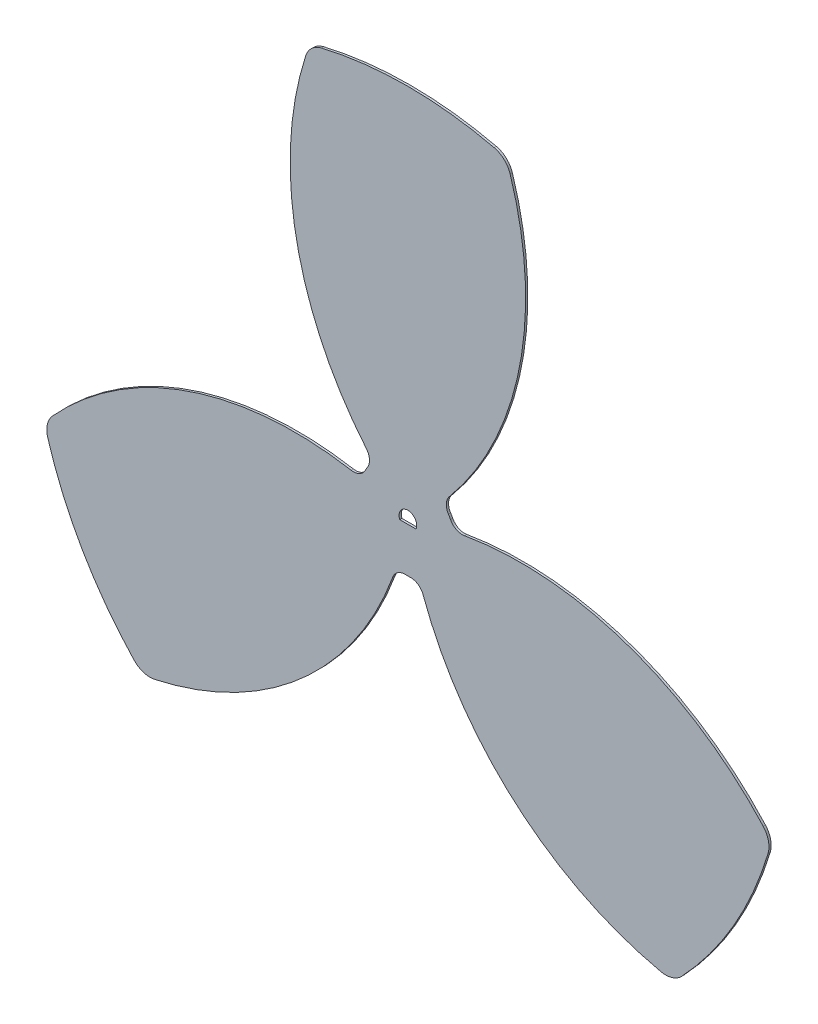
ISO-10303-21;
HEADER;
FILE_DESCRIPTION(('STEP AP214'),'2;1');
FILE_NAME('part.step','',(''),(''),'','','');
FILE_SCHEMA(('AUTOMOTIVE_DESIGN { 1 0 10303 214 1 1 1 1 }'));
ENDSEC;
DATA;
#1=APPLICATION_CONTEXT('core data for automotive mechanical design processes');
#2=APPLICATION_PROTOCOL_DEFINITION('international standard','automotive_design',2000,#1);
#3=PRODUCT_CONTEXT('',#1,'mechanical');
#4=PRODUCT('Part','Part','',(#3));
#5=PRODUCT_RELATED_PRODUCT_CATEGORY('part','',(#4));
#6=PRODUCT_DEFINITION_FORMATION('','',#4);
#7=PRODUCT_DEFINITION_CONTEXT('part definition',#1,'design');
#8=PRODUCT_DEFINITION('design','',#6,#7);
#9=PRODUCT_DEFINITION_SHAPE('','',#8);
#10=(LENGTH_UNIT() NAMED_UNIT(*) SI_UNIT(.MILLI.,.METRE.));
#11=(NAMED_UNIT(*) PLANE_ANGLE_UNIT() SI_UNIT($,.RADIAN.));
#12=(NAMED_UNIT(*) SI_UNIT($,.STERADIAN.) SOLID_ANGLE_UNIT());
#13=UNCERTAINTY_MEASURE_WITH_UNIT(LENGTH_MEASURE(1.E-05),#10,'distance_accuracy_value','');
#14=(GEOMETRIC_REPRESENTATION_CONTEXT(3) GLOBAL_UNCERTAINTY_ASSIGNED_CONTEXT((#13)) GLOBAL_UNIT_ASSIGNED_CONTEXT((#10,
#11,#12)) REPRESENTATION_CONTEXT('',''));
#15=CARTESIAN_POINT('',(0.,0.,0.));
#16=DIRECTION('',(0.,0.,1.));
#17=DIRECTION('',(1.,0.,0.));
#18=AXIS2_PLACEMENT_3D('',#15,#16,#17);
#19=CARTESIAN_POINT('',(51.7426711315438,150.346382184181,1.));
#20=DIRECTION('',(0.,0.,-1.));
#21=DIRECTION('',(-1.,0.,0.));
#22=AXIS2_PLACEMENT_3D('',#19,#20,#21);
#23=CYLINDRICAL_SURFACE('',#22,148.192977627793);
#24=CARTESIAN_POINT('',(51.7426711315438,150.346382184181,0.));
#25=DIRECTION('',(0.,0.,1.));
#26=DIRECTION('',(1.,0.,0.));
#27=AXIS2_PLACEMENT_3D('',#24,#25,#26);
#28=CIRCLE('',#27,148.192977627793);
#29=CARTESIAN_POINT('',(-89.4488248885642,195.358825683678,0.));
#30=VERTEX_POINT('',#29);
#31=CARTESIAN_POINT('',(-61.9898161621901,55.3406983954088,0.));
#32=VERTEX_POINT('',#31);
#33=EDGE_CURVE('E234',#30,#32,#28,.T.);
#34=ORIENTED_EDGE('',*,*,#33,.T.);
#35=DIRECTION('',(0.,0.,-1.));
#36=VECTOR('',#35,1.);
#37=CARTESIAN_POINT('',(-61.9898161621901,55.3406983954088,1.));
#38=LINE('',#37,#36);
#39=CARTESIAN_POINT('',(-61.9898161621901,55.3406983954088,1.));
#40=VERTEX_POINT('',#39);
#41=EDGE_CURVE('E364',#32,#40,#38,.F.);
#42=ORIENTED_EDGE('',*,*,#41,.T.);
#43=CARTESIAN_POINT('',(51.7426711315438,150.346382184181,1.));
#44=DIRECTION('',(0.,0.,1.));
#45=DIRECTION('',(1.,0.,0.));
#46=AXIS2_PLACEMENT_3D('',#43,#44,#45);
#47=CIRCLE('',#46,148.192977627793);
#48=CARTESIAN_POINT('',(-89.4488248885642,195.358825683678,1.));
#49=VERTEX_POINT('',#48);
#50=EDGE_CURVE('E236',#49,#40,#47,.T.);
#51=ORIENTED_EDGE('',*,*,#50,.F.);
#52=DIRECTION('',(0.,0.,-1.));
#53=VECTOR('',#52,1.);
#54=CARTESIAN_POINT('',(-89.4488248885642,195.358825683678,1.));
#55=LINE('',#54,#53);
#56=EDGE_CURVE('E349',#49,#30,#55,.T.);
#57=ORIENTED_EDGE('',*,*,#56,.T.);
#58=EDGE_LOOP('',(#34,#42,#51,#57));
#59=FACE_BOUND('',#58,.T.);
#60=ADVANCED_FACE('F38',(#59),#23,.T.);
#61=CARTESIAN_POINT('',(-43.2289950101138,36.5854871082849,1.));
#62=DIRECTION('',(0.,0.,-1.));
#63=DIRECTION('',(-1.,0.,0.));
#64=AXIS2_PLACEMENT_3D('',#61,#62,#63);
#65=CYLINDRICAL_SURFACE('',#64,21.7167576854567);
#66=CARTESIAN_POINT('',(-43.2289950101138,36.5854871082849,1.));
#67=DIRECTION('',(0.,0.,1.));
#68=DIRECTION('',(1.,0.,0.));
#69=AXIS2_PLACEMENT_3D('',#66,#67,#68);
#70=CIRCLE('',#69,21.7167576854567);
#71=CARTESIAN_POINT('',(-61.5365091037477,48.2667752256219,1.));
#72=VERTEX_POINT('',#71);
#73=CARTESIAN_POINT('',(-62.4990443154705,46.599615334844,1.));
#74=VERTEX_POINT('',#73);
#75=EDGE_CURVE('E239',#72,#74,#70,.T.);
#76=ORIENTED_EDGE('',*,*,#75,.F.);
#77=DIRECTION('',(0.,0.,-1.));
#78=VECTOR('',#77,1.);
#79=CARTESIAN_POINT('',(-61.5365091037477,48.2667752256219,1.));
#80=LINE('',#79,#78);
#81=CARTESIAN_POINT('',(-61.5365091037477,48.2667752256219,0.));
#82=VERTEX_POINT('',#81);
#83=EDGE_CURVE('E361',#72,#82,#80,.T.);
#84=ORIENTED_EDGE('',*,*,#83,.T.);
#85=CARTESIAN_POINT('',(-43.2289950101138,36.5854871082849,0.));
#86=DIRECTION('',(0.,0.,1.));
#87=DIRECTION('',(1.,0.,0.));
#88=AXIS2_PLACEMENT_3D('',#85,#86,#87);
#89=CIRCLE('',#88,21.7167576854567);
#90=CARTESIAN_POINT('',(-62.4990443154705,46.599615334844,0.));
#91=VERTEX_POINT('',#90);
#92=EDGE_CURVE('E274',#82,#91,#89,.T.);
#93=ORIENTED_EDGE('',*,*,#92,.T.);
#94=DIRECTION('',(0.,0.,-1.));
#95=VECTOR('',#94,1.);
#96=CARTESIAN_POINT('',(-62.4990443154705,46.599615334844,1.));
#97=LINE('',#96,#95);
#98=EDGE_CURVE('E359',#91,#74,#97,.F.);
#99=ORIENTED_EDGE('',*,*,#98,.T.);
#100=EDGE_LOOP('',(#76,#84,#93,#99));
#101=FACE_BOUND('',#100,.T.);
#102=ADVANCED_FACE('F478',(#101),#65,.T.);
#103=CARTESIAN_POINT('',(-94.2629870322673,-102.542835948076,1.));
#104=DIRECTION('',(0.,0.,-1.));
#105=DIRECTION('',(-1.,0.,0.));
#106=AXIS2_PLACEMENT_3D('',#103,#104,#105);
#107=CYLINDRICAL_SURFACE('',#106,148.192977627794);
#108=CARTESIAN_POINT('',(-94.2629870322673,-102.542835948076,1.));
#109=DIRECTION('',(0.,0.,1.));
#110=DIRECTION('',(1.,0.,0.));
#111=AXIS2_PLACEMENT_3D('',#108,#109,#110);
#112=CIRCLE('',#111,148.192977627794);
#113=CARTESIAN_POINT('',(-203.840654599297,-2.77363534607959,1.));
#114=VERTEX_POINT('',#113);
#115=CARTESIAN_POINT('',(-68.8518950141466,43.4552291782761,1.));
#116=VERTEX_POINT('',#115);
#117=EDGE_CURVE('E243',#114,#116,#112,.F.);
#118=ORIENTED_EDGE('',*,*,#117,.T.);
#119=DIRECTION('',(0.,0.,-1.));
#120=VECTOR('',#119,1.);
#121=CARTESIAN_POINT('',(-68.8518950141466,43.4552291782761,1.));
#122=LINE('',#121,#120);
#123=CARTESIAN_POINT('',(-68.8518950141466,43.4552291782761,0.));
#124=VERTEX_POINT('',#123);
#125=EDGE_CURVE('E366',#116,#124,#122,.T.);
#126=ORIENTED_EDGE('',*,*,#125,.T.);
#127=CARTESIAN_POINT('',(-94.2629870322673,-102.542835948076,0.));
#128=DIRECTION('',(0.,0.,1.));
#129=DIRECTION('',(1.,0.,0.));
#130=AXIS2_PLACEMENT_3D('',#127,#128,#129);
#131=CIRCLE('',#130,148.192977627794);
#132=CARTESIAN_POINT('',(-203.840654599297,-2.77363534607959,0.));
#133=VERTEX_POINT('',#132);
#134=EDGE_CURVE('E277',#133,#124,#131,.F.);
#135=ORIENTED_EDGE('',*,*,#134,.F.);
#136=DIRECTION('',(0.,0.,-1.));
#137=VECTOR('',#136,1.);
#138=CARTESIAN_POINT('',(-203.840654599297,-2.77363534607959,1.));
#139=LINE('',#138,#137);
#140=EDGE_CURVE('E347',#133,#114,#139,.F.);
#141=ORIENTED_EDGE('',*,*,#140,.T.);
#142=EDGE_LOOP('',(#118,#126,#135,#141));
#143=FACE_BOUND('',#142,.T.);
#144=ADVANCED_FACE('F486',(#143),#107,.T.);
#145=CARTESIAN_POINT('',(-43.2289950101138,36.5854871082849,1.));
#146=DIRECTION('',(0.,0.,-1.));
#147=DIRECTION('',(-1.,0.,0.));
#148=AXIS2_PLACEMENT_3D('',#145,#146,#147);
#149=CYLINDRICAL_SURFACE('',#148,170.000000000001);
#150=CARTESIAN_POINT('',(-43.2289950101138,36.5854871082849,0.));
#151=DIRECTION('',(0.,0.,1.));
#152=DIRECTION('',(1.,0.,0.));
#153=AXIS2_PLACEMENT_3D('',#150,#151,#152);
#154=CIRCLE('',#153,170.000000000001);
#155=CARTESIAN_POINT('',(-206.022487315277,-12.386738316838,0.));
#156=VERTEX_POINT('',#155);
#157=CARTESIAN_POINT('',(-167.036932460708,-79.911700086213,0.));
#158=VERTEX_POINT('',#157);
#159=EDGE_CURVE('E280',#156,#158,#154,.T.);
#160=ORIENTED_EDGE('',*,*,#159,.T.);
#161=DIRECTION('',(0.,0.,-1.));
#162=VECTOR('',#161,1.);
#163=CARTESIAN_POINT('',(-167.036932460708,-79.911700086213,1.));
#164=LINE('',#163,#162);
#165=CARTESIAN_POINT('',(-167.036932460708,-79.911700086213,1.));
#166=VERTEX_POINT('',#165);
#167=EDGE_CURVE('E345',#158,#166,#164,.F.);
#168=ORIENTED_EDGE('',*,*,#167,.T.);
#169=CARTESIAN_POINT('',(-43.2289950101138,36.5854871082849,1.));
#170=DIRECTION('',(0.,0.,1.));
#171=DIRECTION('',(1.,0.,0.));
#172=AXIS2_PLACEMENT_3D('',#169,#170,#171);
#173=CIRCLE('',#172,170.000000000001);
#174=CARTESIAN_POINT('',(-206.022487315277,-12.386738316838,1.));
#175=VERTEX_POINT('',#174);
#176=EDGE_CURVE('E246',#175,#166,#173,.T.);
#177=ORIENTED_EDGE('',*,*,#176,.F.);
#178=DIRECTION('',(0.,0.,-1.));
#179=VECTOR('',#178,1.);
#180=CARTESIAN_POINT('',(-206.022487315277,-12.386738316838,1.));
#181=LINE('',#180,#179);
#182=EDGE_CURVE('E342',#175,#156,#181,.T.);
#183=ORIENTED_EDGE('',*,*,#182,.T.);
#184=EDGE_LOOP('',(#160,#168,#177,#183));
#185=FACE_BOUND('',#184,.T.);
#186=ADVANCED_FACE('F496',(#185),#149,.T.);
#187=CARTESIAN_POINT('',(-189.234653173923,61.9529150887447,1.));
#188=DIRECTION('',(0.,0.,-1.));
#189=DIRECTION('',(-1.,0.,0.));
#190=AXIS2_PLACEMENT_3D('',#187,#188,#189);
#191=CYLINDRICAL_SURFACE('',#190,148.192977627792);
#192=CARTESIAN_POINT('',(-189.234653173923,61.9529150887447,0.));
#193=DIRECTION('',(0.,0.,1.));
#194=DIRECTION('',(1.,0.,0.));
#195=AXIS2_PLACEMENT_3D('',#192,#193,#194);
#196=CIRCLE('',#195,148.192977627792);
#197=CARTESIAN_POINT('',(-157.620824720846,-82.828729012746,0.));
#198=VERTEX_POINT('',#197);
#199=CARTESIAN_POINT('',(-50.0910738620683,10.9605337511684,0.));
#200=VERTEX_POINT('',#199);
#201=EDGE_CURVE('E283',#198,#200,#196,.T.);
#202=ORIENTED_EDGE('',*,*,#201,.T.);
#203=DIRECTION('',(0.,0.,-1.));
#204=VECTOR('',#203,1.);
#205=CARTESIAN_POINT('',(-50.0910738620683,10.9605337511684,1.));
#206=LINE('',#205,#204);
#207=CARTESIAN_POINT('',(-50.0910738620683,10.9605337511684,1.));
#208=VERTEX_POINT('',#207);
#209=EDGE_CURVE('E400',#200,#208,#206,.F.);
#210=ORIENTED_EDGE('',*,*,#209,.T.);
#211=CARTESIAN_POINT('',(-189.234653173923,61.9529150887447,1.));
#212=DIRECTION('',(0.,0.,1.));
#213=DIRECTION('',(1.,0.,0.));
#214=AXIS2_PLACEMENT_3D('',#211,#212,#213);
#215=CIRCLE('',#214,148.192977627792);
#216=CARTESIAN_POINT('',(-157.620824720846,-82.828729012746,1.));
#217=VERTEX_POINT('',#216);
#218=EDGE_CURVE('E249',#217,#208,#215,.T.);
#219=ORIENTED_EDGE('',*,*,#218,.F.);
#220=DIRECTION('',(0.,0.,-1.));
#221=VECTOR('',#220,1.);
#222=CARTESIAN_POINT('',(-157.620824720846,-82.828729012746,1.));
#223=LINE('',#222,#221);
#224=EDGE_CURVE('E339',#217,#198,#223,.T.);
#225=ORIENTED_EDGE('',*,*,#224,.T.);
#226=EDGE_LOOP('',(#202,#210,#219,#225));
#227=FACE_BOUND('',#226,.T.);
#228=ADVANCED_FACE('F505',(#227),#191,.T.);
#229=CARTESIAN_POINT('',(-43.2289950101138,36.5854871082849,1.));
#230=DIRECTION('',(0.,0.,-1.));
#231=DIRECTION('',(-1.,0.,0.));
#232=AXIS2_PLACEMENT_3D('',#229,#230,#231);
#233=CYLINDRICAL_SURFACE('',#232,21.7167576854567);
#234=CARTESIAN_POINT('',(-43.2289950101138,36.5854871082849,1.));
#235=DIRECTION('',(0.,0.,1.));
#236=DIRECTION('',(1.,0.,0.));
#237=AXIS2_PLACEMENT_3D('',#234,#235,#236);
#238=CIRCLE('',#237,21.7167576854567);
#239=CARTESIAN_POINT('',(-44.191530221835,14.8900707643878,1.));
#240=VERTEX_POINT('',#239);
#241=CARTESIAN_POINT('',(-42.2664597983906,14.8900707643879,1.));
#242=VERTEX_POINT('',#241);
#243=EDGE_CURVE('E252',#240,#242,#238,.T.);
#244=ORIENTED_EDGE('',*,*,#243,.F.);
#245=DIRECTION('',(0.,0.,-1.));
#246=VECTOR('',#245,1.);
#247=CARTESIAN_POINT('',(-44.191530221835,14.8900707643878,1.));
#248=LINE('',#247,#246);
#249=CARTESIAN_POINT('',(-44.191530221835,14.8900707643878,0.));
#250=VERTEX_POINT('',#249);
#251=EDGE_CURVE('E397',#240,#250,#248,.T.);
#252=ORIENTED_EDGE('',*,*,#251,.T.);
#253=CARTESIAN_POINT('',(-43.2289950101138,36.5854871082849,0.));
#254=DIRECTION('',(0.,0.,1.));
#255=DIRECTION('',(1.,0.,0.));
#256=AXIS2_PLACEMENT_3D('',#253,#254,#255);
#257=CIRCLE('',#256,21.7167576854567);
#258=CARTESIAN_POINT('',(-42.2664597983906,14.8900707643879,0.));
#259=VERTEX_POINT('',#258);
#260=EDGE_CURVE('E286',#250,#259,#257,.T.);
#261=ORIENTED_EDGE('',*,*,#260,.T.);
#262=DIRECTION('',(0.,0.,-1.));
#263=VECTOR('',#262,1.);
#264=CARTESIAN_POINT('',(-42.2664597983906,14.8900707643879,1.));
#265=LINE('',#264,#263);
#266=EDGE_CURVE('E395',#259,#242,#265,.F.);
#267=ORIENTED_EDGE('',*,*,#266,.T.);
#268=EDGE_LOOP('',(#244,#252,#261,#267));
#269=FACE_BOUND('',#268,.T.);
#270=ADVANCED_FACE('F414',(#269),#233,.T.);
#271=CARTESIAN_POINT('',(102.776663153701,61.9529150887455,1.));
#272=DIRECTION('',(0.,0.,-1.));
#273=DIRECTION('',(-1.,0.,0.));
#274=AXIS2_PLACEMENT_3D('',#271,#272,#273);
#275=CYLINDRICAL_SURFACE('',#274,148.192977627795);
#276=CARTESIAN_POINT('',(102.776663153701,61.9529150887455,1.));
#277=DIRECTION('',(0.,0.,1.));
#278=DIRECTION('',(1.,0.,0.));
#279=AXIS2_PLACEMENT_3D('',#276,#277,#278);
#280=CIRCLE('',#279,148.192977627795);
#281=CARTESIAN_POINT('',(71.1628347006211,-82.8287290127473,1.));
#282=VERTEX_POINT('',#281);
#283=CARTESIAN_POINT('',(-36.3669161581567,10.9605337511686,1.));
#284=VERTEX_POINT('',#283);
#285=EDGE_CURVE('E254',#282,#284,#280,.F.);
#286=ORIENTED_EDGE('',*,*,#285,.T.);
#287=DIRECTION('',(0.,0.,-1.));
#288=VECTOR('',#287,1.);
#289=CARTESIAN_POINT('',(-36.3669161581567,10.9605337511686,1.));
#290=LINE('',#289,#288);
#291=CARTESIAN_POINT('',(-36.3669161581567,10.9605337511686,0.));
#292=VERTEX_POINT('',#291);
#293=EDGE_CURVE('E402',#284,#292,#290,.T.);
#294=ORIENTED_EDGE('',*,*,#293,.T.);
#295=CARTESIAN_POINT('',(102.776663153701,61.9529150887455,0.));
#296=DIRECTION('',(0.,0.,1.));
#297=DIRECTION('',(1.,0.,0.));
#298=AXIS2_PLACEMENT_3D('',#295,#296,#297);
#299=CIRCLE('',#298,148.192977627795);
#300=CARTESIAN_POINT('',(71.1628347006211,-82.8287290127473,0.));
#301=VERTEX_POINT('',#300);
#302=EDGE_CURVE('E289',#301,#292,#299,.F.);
#303=ORIENTED_EDGE('',*,*,#302,.F.);
#304=DIRECTION('',(0.,0.,-1.));
#305=VECTOR('',#304,1.);
#306=CARTESIAN_POINT('',(71.1628347006211,-82.8287290127473,1.));
#307=LINE('',#306,#305);
#308=EDGE_CURVE('E337',#301,#282,#307,.F.);
#309=ORIENTED_EDGE('',*,*,#308,.T.);
#310=EDGE_LOOP('',(#286,#294,#303,#309));
#311=FACE_BOUND('',#310,.T.);
#312=ADVANCED_FACE('F417',(#311),#275,.T.);
#313=CARTESIAN_POINT('',(-43.2289950101138,36.5854871082849,1.));
#314=DIRECTION('',(0.,0.,-1.));
#315=DIRECTION('',(-1.,0.,0.));
#316=AXIS2_PLACEMENT_3D('',#313,#314,#315);
#317=CYLINDRICAL_SURFACE('',#316,170.000000000003);
#318=CARTESIAN_POINT('',(-43.2289950101138,36.5854871082849,0.));
#319=DIRECTION('',(0.,0.,1.));
#320=DIRECTION('',(1.,0.,0.));
#321=AXIS2_PLACEMENT_3D('',#318,#319,#320);
#322=CIRCLE('',#321,170.000000000003);
#323=CARTESIAN_POINT('',(80.5789424404832,-79.9117000862143,0.));
#324=VERTEX_POINT('',#323);
#325=CARTESIAN_POINT('',(119.564497295052,-12.3867383168368,0.));
#326=VERTEX_POINT('',#325);
#327=EDGE_CURVE('E292',#324,#326,#322,.T.);
#328=ORIENTED_EDGE('',*,*,#327,.T.);
#329=DIRECTION('',(0.,0.,-1.));
#330=VECTOR('',#329,1.);
#331=CARTESIAN_POINT('',(119.564497295052,-12.3867383168369,1.));
#332=LINE('',#331,#330);
#333=CARTESIAN_POINT('',(119.564497295052,-12.3867383168368,1.));
#334=VERTEX_POINT('',#333);
#335=EDGE_CURVE('E323',#326,#334,#332,.F.);
#336=ORIENTED_EDGE('',*,*,#335,.T.);
#337=CARTESIAN_POINT('',(-43.2289950101138,36.5854871082849,1.));
#338=DIRECTION('',(0.,0.,1.));
#339=DIRECTION('',(1.,0.,0.));
#340=AXIS2_PLACEMENT_3D('',#337,#338,#339);
#341=CIRCLE('',#340,170.000000000003);
#342=CARTESIAN_POINT('',(80.5789424404832,-79.9117000862143,1.));
#343=VERTEX_POINT('',#342);
#344=EDGE_CURVE('E256',#343,#334,#341,.T.);
#345=ORIENTED_EDGE('',*,*,#344,.F.);
#346=DIRECTION('',(0.,0.,-1.));
#347=VECTOR('',#346,1.);
#348=CARTESIAN_POINT('',(80.5789424404832,-79.9117000862143,1.));
#349=LINE('',#348,#347);
#350=EDGE_CURVE('E320',#343,#324,#349,.T.);
#351=ORIENTED_EDGE('',*,*,#350,.T.);
#352=EDGE_LOOP('',(#328,#336,#345,#351));
#353=FACE_BOUND('',#352,.T.);
#354=ADVANCED_FACE('F426',(#353),#317,.T.);
#355=CARTESIAN_POINT('',(7.80499701204253,-102.542835948074,1.));
#356=DIRECTION('',(0.,0.,-1.));
#357=DIRECTION('',(-1.,0.,0.));
#358=AXIS2_PLACEMENT_3D('',#355,#356,#357);
#359=CYLINDRICAL_SURFACE('',#358,148.192977627794);
#360=CARTESIAN_POINT('',(7.80499701204253,-102.542835948074,0.));
#361=DIRECTION('',(0.,0.,1.));
#362=DIRECTION('',(1.,0.,0.));
#363=AXIS2_PLACEMENT_3D('',#360,#361,#362);
#364=CIRCLE('',#363,148.192977627794);
#365=CARTESIAN_POINT('',(117.382664579073,-2.77363534607858,0.));
#366=VERTEX_POINT('',#365);
#367=CARTESIAN_POINT('',(-17.6060950060815,43.4552291782772,0.));
#368=VERTEX_POINT('',#367);
#369=EDGE_CURVE('E295',#366,#368,#364,.T.);
#370=ORIENTED_EDGE('',*,*,#369,.T.);
#371=DIRECTION('',(0.,0.,-1.));
#372=VECTOR('',#371,1.);
#373=CARTESIAN_POINT('',(-17.6060950060815,43.4552291782772,1.));
#374=LINE('',#373,#372);
#375=CARTESIAN_POINT('',(-17.6060950060815,43.4552291782772,1.));
#376=VERTEX_POINT('',#375);
#377=EDGE_CURVE('E382',#368,#376,#374,.F.);
#378=ORIENTED_EDGE('',*,*,#377,.T.);
#379=CARTESIAN_POINT('',(7.80499701204253,-102.542835948074,1.));
#380=DIRECTION('',(0.,0.,1.));
#381=DIRECTION('',(1.,0.,0.));
#382=AXIS2_PLACEMENT_3D('',#379,#380,#381);
#383=CIRCLE('',#382,148.192977627794);
#384=CARTESIAN_POINT('',(117.382664579073,-2.77363534607858,1.));
#385=VERTEX_POINT('',#384);
#386=EDGE_CURVE('E259',#385,#376,#383,.T.);
#387=ORIENTED_EDGE('',*,*,#386,.F.);
#388=DIRECTION('',(0.,0.,-1.));
#389=VECTOR('',#388,1.);
#390=CARTESIAN_POINT('',(117.382664579073,-2.77363534607858,1.));
#391=LINE('',#390,#389);
#392=EDGE_CURVE('E271',#385,#366,#391,.T.);
#393=ORIENTED_EDGE('',*,*,#392,.T.);
#394=EDGE_LOOP('',(#370,#378,#387,#393));
#395=FACE_BOUND('',#394,.T.);
#396=ADVANCED_FACE('F434',(#395),#359,.T.);
#397=CARTESIAN_POINT('',(-43.2289950101138,36.5854871082849,1.));
#398=DIRECTION('',(0.,0.,-1.));
#399=DIRECTION('',(-1.,0.,0.));
#400=AXIS2_PLACEMENT_3D('',#397,#398,#399);
#401=CYLINDRICAL_SURFACE('',#400,21.7167576854567);
#402=CARTESIAN_POINT('',(-43.2289950101138,36.5854871082849,1.));
#403=DIRECTION('',(0.,0.,1.));
#404=DIRECTION('',(1.,0.,0.));
#405=AXIS2_PLACEMENT_3D('',#402,#403,#404);
#406=CIRCLE('',#405,21.7167576854567);
#407=CARTESIAN_POINT('',(-23.9589457047576,46.5996153348448,1.));
#408=VERTEX_POINT('',#407);
#409=CARTESIAN_POINT('',(-24.9214809164799,48.2667752256219,1.));
#410=VERTEX_POINT('',#409);
#411=EDGE_CURVE('E262',#408,#410,#406,.T.);
#412=ORIENTED_EDGE('',*,*,#411,.F.);
#413=DIRECTION('',(0.,0.,-1.));
#414=VECTOR('',#413,1.);
#415=CARTESIAN_POINT('',(-23.9589457047576,46.5996153348448,1.));
#416=LINE('',#415,#414);
#417=CARTESIAN_POINT('',(-23.9589457047576,46.5996153348448,0.));
#418=VERTEX_POINT('',#417);
#419=EDGE_CURVE('E379',#408,#418,#416,.T.);
#420=ORIENTED_EDGE('',*,*,#419,.T.);
#421=CARTESIAN_POINT('',(-43.2289950101138,36.5854871082849,0.));
#422=DIRECTION('',(0.,0.,1.));
#423=DIRECTION('',(1.,0.,0.));
#424=AXIS2_PLACEMENT_3D('',#421,#422,#423);
#425=CIRCLE('',#424,21.7167576854567);
#426=CARTESIAN_POINT('',(-24.9214809164799,48.2667752256219,0.));
#427=VERTEX_POINT('',#426);
#428=EDGE_CURVE('E298',#418,#427,#425,.T.);
#429=ORIENTED_EDGE('',*,*,#428,.T.);
#430=DIRECTION('',(0.,0.,-1.));
#431=VECTOR('',#430,1.);
#432=CARTESIAN_POINT('',(-24.9214809164799,48.2667752256219,1.));
#433=LINE('',#432,#431);
#434=EDGE_CURVE('E377',#427,#410,#433,.F.);
#435=ORIENTED_EDGE('',*,*,#434,.T.);
#436=EDGE_LOOP('',(#412,#420,#429,#435));
#437=FACE_BOUND('',#436,.T.);
#438=ADVANCED_FACE('F443',(#437),#401,.T.);
#439=CARTESIAN_POINT('',(-138.200661151771,150.346382184181,1.));
#440=DIRECTION('',(0.,0.,-1.));
#441=DIRECTION('',(-1.,0.,0.));
#442=AXIS2_PLACEMENT_3D('',#439,#440,#441);
#443=CYLINDRICAL_SURFACE('',#442,148.192977627793);
#444=CARTESIAN_POINT('',(-138.200661151771,150.346382184181,1.));
#445=DIRECTION('',(0.,0.,1.));
#446=DIRECTION('',(1.,0.,0.));
#447=AXIS2_PLACEMENT_3D('',#444,#445,#446);
#448=CIRCLE('',#447,148.192977627793);
#449=CARTESIAN_POINT('',(2.99083486833651,195.358825683678,1.));
#450=VERTEX_POINT('',#449);
#451=CARTESIAN_POINT('',(-24.4681738580376,55.3406983954088,1.));
#452=VERTEX_POINT('',#451);
#453=EDGE_CURVE('E265',#450,#452,#448,.F.);
#454=ORIENTED_EDGE('',*,*,#453,.T.);
#455=DIRECTION('',(0.,0.,-1.));
#456=VECTOR('',#455,1.);
#457=CARTESIAN_POINT('',(-24.4681738580376,55.3406983954088,1.));
#458=LINE('',#457,#456);
#459=CARTESIAN_POINT('',(-24.4681738580376,55.3406983954088,0.));
#460=VERTEX_POINT('',#459);
#461=EDGE_CURVE('E384',#452,#460,#458,.T.);
#462=ORIENTED_EDGE('',*,*,#461,.T.);
#463=CARTESIAN_POINT('',(-138.200661151771,150.346382184181,0.));
#464=DIRECTION('',(0.,0.,1.));
#465=DIRECTION('',(1.,0.,0.));
#466=AXIS2_PLACEMENT_3D('',#463,#464,#465);
#467=CIRCLE('',#466,148.192977627793);
#468=CARTESIAN_POINT('',(2.99083486833651,195.358825683678,0.));
#469=VERTEX_POINT('',#468);
#470=EDGE_CURVE('E301',#469,#460,#467,.F.);
#471=ORIENTED_EDGE('',*,*,#470,.F.);
#472=DIRECTION('',(0.,0.,-1.));
#473=VECTOR('',#472,1.);
#474=CARTESIAN_POINT('',(2.99083486833651,195.358825683678,1.));
#475=LINE('',#474,#473);
#476=EDGE_CURVE('E357',#469,#450,#475,.F.);
#477=ORIENTED_EDGE('',*,*,#476,.T.);
#478=EDGE_LOOP('',(#454,#462,#471,#477));
#479=FACE_BOUND('',#478,.T.);
#480=ADVANCED_FACE('F451',(#479),#443,.T.);
#481=CARTESIAN_POINT('',(-43.2289950101138,36.5854871082849,1.));
#482=DIRECTION('',(0.,0.,-1.));
#483=DIRECTION('',(-1.,0.,0.));
#484=AXIS2_PLACEMENT_3D('',#481,#482,#483);
#485=CYLINDRICAL_SURFACE('',#484,170.);
#486=CARTESIAN_POINT('',(-43.2289950101138,36.5854871082849,0.));
#487=DIRECTION('',(0.,0.,1.));
#488=DIRECTION('',(1.,0.,0.));
#489=AXIS2_PLACEMENT_3D('',#486,#487,#488);
#490=CIRCLE('',#489,170.);
#491=CARTESIAN_POINT('',(-4.24344015554617,202.054899727903,0.));
#492=VERTEX_POINT('',#491);
#493=CARTESIAN_POINT('',(-82.2145498646815,202.054899727903,0.));
#494=VERTEX_POINT('',#493);
#495=EDGE_CURVE('E240',#492,#494,#490,.T.);
#496=ORIENTED_EDGE('',*,*,#495,.T.);
#497=DIRECTION('',(0.,0.,-1.));
#498=VECTOR('',#497,1.);
#499=CARTESIAN_POINT('',(-82.2145498646815,202.054899727903,1.));
#500=LINE('',#499,#498);
#501=CARTESIAN_POINT('',(-82.2145498646815,202.054899727903,1.));
#502=VERTEX_POINT('',#501);
#503=EDGE_CURVE('E355',#494,#502,#500,.F.);
#504=ORIENTED_EDGE('',*,*,#503,.T.);
#505=CARTESIAN_POINT('',(-43.2289950101138,36.5854871082849,1.));
#506=DIRECTION('',(0.,0.,1.));
#507=DIRECTION('',(1.,0.,0.));
#508=AXIS2_PLACEMENT_3D('',#505,#506,#507);
#509=CIRCLE('',#508,170.);
#510=CARTESIAN_POINT('',(-4.24344015554617,202.054899727903,1.));
#511=VERTEX_POINT('',#510);
#512=EDGE_CURVE('E268',#511,#502,#509,.T.);
#513=ORIENTED_EDGE('',*,*,#512,.F.);
#514=DIRECTION('',(0.,0.,-1.));
#515=VECTOR('',#514,1.);
#516=CARTESIAN_POINT('',(-4.24344015554617,202.054899727903,1.));
#517=LINE('',#516,#515);
#518=EDGE_CURVE('E352',#511,#492,#517,.T.);
#519=ORIENTED_EDGE('',*,*,#518,.T.);
#520=EDGE_LOOP('',(#496,#504,#513,#519));
#521=FACE_BOUND('',#520,.T.);
#522=ADVANCED_FACE('F461',(#521),#485,.T.);
#523=CARTESIAN_POINT('',(0.,0.,1.));
#524=DIRECTION('',(0.,0.,1.));
#525=DIRECTION('',(1.,0.,0.));
#526=AXIS2_PLACEMENT_3D('',#523,#524,#525);
#527=PLANE('',#526);
#528=CARTESIAN_POINT('',(-43.2289950101138,36.5854871082849,1.));
#529=DIRECTION('',(0.,0.,-1.));
#530=DIRECTION('',(1.,0.,0.));
#531=AXIS2_PLACEMENT_3D('',#528,#529,#530);
#532=CIRCLE('',#531,4.00000000000001);
#533=CARTESIAN_POINT('',(-46.9370942536617,35.0854871082849,1.));
#534=VERTEX_POINT('',#533);
#535=CARTESIAN_POINT('',(-39.520895766566,35.0854871082849,1.));
#536=VERTEX_POINT('',#535);
#537=EDGE_CURVE('E214',#534,#536,#532,.T.);
#538=ORIENTED_EDGE('',*,*,#537,.T.);
#539=DIRECTION('',(-1.,0.,0.));
#540=VECTOR('',#539,1.);
#541=CARTESIAN_POINT('',(-46.9370942536617,35.0854871082849,1.));
#542=LINE('',#541,#540);
#543=EDGE_CURVE('E222',#536,#534,#542,.T.);
#544=ORIENTED_EDGE('',*,*,#543,.T.);
#545=EDGE_LOOP('',(#538,#544));
#546=FACE_BOUND('',#545,.T.);
#547=ORIENTED_EDGE('',*,*,#344,.T.);
#548=CARTESIAN_POINT('',(109.988409512396,-9.50601917418269,1.));
#549=DIRECTION('',(0.,0.,1.));
#550=DIRECTION('',(1.,0.,0.));
#551=AXIS2_PLACEMENT_3D('',#548,#549,#550);
#552=CIRCLE('',#551,10.);
#553=EDGE_CURVE('E335',#334,#385,#552,.T.);
#554=ORIENTED_EDGE('',*,*,#553,.T.);
#555=ORIENTED_EDGE('',*,*,#386,.T.);
#556=CARTESIAN_POINT('',(-18.6349329075082,49.3663621130527,1.));
#557=DIRECTION('',(0.,0.,1.));
#558=DIRECTION('',(1.,0.,0.));
#559=AXIS2_PLACEMENT_3D('',#556,#557,#558);
#560=CIRCLE('',#559,6.);
#561=EDGE_CURVE('E389',#376,#408,#560,.F.);
#562=ORIENTED_EDGE('',*,*,#561,.T.);
#563=ORIENTED_EDGE('',*,*,#411,.T.);
#564=CARTESIAN_POINT('',(-19.8634015220884,51.4941321690093,1.));
#565=DIRECTION('',(0.,0.,1.));
#566=DIRECTION('',(1.,0.,0.));
#567=AXIS2_PLACEMENT_3D('',#564,#565,#566);
#568=CIRCLE('',#567,6.);
#569=EDGE_CURVE('E393',#410,#452,#568,.F.);
#570=ORIENTED_EDGE('',*,*,#569,.T.);
#571=ORIENTED_EDGE('',*,*,#453,.F.);
#572=CARTESIAN_POINT('',(-6.53670808816779,192.321404867926,1.));
#573=DIRECTION('',(0.,0.,1.));
#574=DIRECTION('',(1.,0.,0.));
#575=AXIS2_PLACEMENT_3D('',#572,#573,#574);
#576=CIRCLE('',#575,10.);
#577=EDGE_CURVE('E325',#450,#511,#576,.T.);
#578=ORIENTED_EDGE('',*,*,#577,.T.);
#579=ORIENTED_EDGE('',*,*,#512,.T.);
#580=CARTESIAN_POINT('',(-79.9212819320599,192.321404867926,1.));
#581=DIRECTION('',(0.,0.,1.));
#582=DIRECTION('',(1.,0.,0.));
#583=AXIS2_PLACEMENT_3D('',#580,#581,#582);
#584=CIRCLE('',#583,10.);
#585=EDGE_CURVE('E327',#502,#49,#584,.T.);
#586=ORIENTED_EDGE('',*,*,#585,.T.);
#587=ORIENTED_EDGE('',*,*,#50,.T.);
#588=CARTESIAN_POINT('',(-66.5945884981393,51.4941321690093,1.));
#589=DIRECTION('',(0.,0.,1.));
#590=DIRECTION('',(1.,0.,0.));
#591=AXIS2_PLACEMENT_3D('',#588,#589,#590);
#592=CIRCLE('',#591,6.);
#593=EDGE_CURVE('E371',#40,#72,#592,.F.);
#594=ORIENTED_EDGE('',*,*,#593,.T.);
#595=ORIENTED_EDGE('',*,*,#75,.T.);
#596=CARTESIAN_POINT('',(-67.8230571127201,49.3663621130517,1.));
#597=DIRECTION('',(0.,0.,1.));
#598=DIRECTION('',(1.,0.,0.));
#599=AXIS2_PLACEMENT_3D('',#596,#597,#598);
#600=CIRCLE('',#599,6.);
#601=EDGE_CURVE('E375',#74,#116,#600,.F.);
#602=ORIENTED_EDGE('',*,*,#601,.T.);
#603=ORIENTED_EDGE('',*,*,#117,.F.);
#604=CARTESIAN_POINT('',(-196.44639953262,-9.50601917418375,1.));
#605=DIRECTION('',(0.,0.,1.));
#606=DIRECTION('',(1.,0.,0.));
#607=AXIS2_PLACEMENT_3D('',#604,#605,#606);
#608=CIRCLE('',#607,10.);
#609=EDGE_CURVE('E329',#114,#175,#608,.T.);
#610=ORIENTED_EDGE('',*,*,#609,.T.);
#611=ORIENTED_EDGE('',*,*,#176,.T.);
#612=CARTESIAN_POINT('',(-159.754112610673,-73.0589243688896,1.));
#613=DIRECTION('',(0.,0.,1.));
#614=DIRECTION('',(1.,0.,0.));
#615=AXIS2_PLACEMENT_3D('',#612,#613,#614);
#616=CIRCLE('',#615,10.);
#617=EDGE_CURVE('E331',#166,#217,#616,.T.);
#618=ORIENTED_EDGE('',*,*,#617,.T.);
#619=ORIENTED_EDGE('',*,*,#218,.T.);
#620=CARTESIAN_POINT('',(-44.4574636246926,8.89596704279234,1.));
#621=DIRECTION('',(0.,0.,1.));
#622=DIRECTION('',(1.,0.,0.));
#623=AXIS2_PLACEMENT_3D('',#620,#621,#622);
#624=CIRCLE('',#623,6.);
#625=EDGE_CURVE('E406',#208,#240,#624,.F.);
#626=ORIENTED_EDGE('',*,*,#625,.T.);
#627=ORIENTED_EDGE('',*,*,#243,.T.);
#628=CARTESIAN_POINT('',(-42.0005263955325,8.89596704279258,1.));
#629=DIRECTION('',(0.,0.,1.));
#630=DIRECTION('',(1.,0.,0.));
#631=AXIS2_PLACEMENT_3D('',#628,#629,#630);
#632=CIRCLE('',#631,6.);
#633=EDGE_CURVE('E11',#242,#284,#632,.F.);
#634=ORIENTED_EDGE('',*,*,#633,.T.);
#635=ORIENTED_EDGE('',*,*,#285,.F.);
#636=CARTESIAN_POINT('',(73.2961225904483,-73.058924368891,1.));
#637=DIRECTION('',(0.,0.,1.));
#638=DIRECTION('',(1.,0.,0.));
#639=AXIS2_PLACEMENT_3D('',#636,#637,#638);
#640=CIRCLE('',#639,10.);
#641=EDGE_CURVE('E333',#282,#343,#640,.T.);
#642=ORIENTED_EDGE('',*,*,#641,.T.);
#643=EDGE_LOOP('',(#547,#554,#555,#562,#563,#570,#571,#578,#579,#586,#587,#594,#595,#602,#603,
#610,#611,#618,#619,#626,#627,#634,#635,#642));
#644=FACE_BOUND('',#643,.T.);
#645=ADVANCED_FACE('F228',(#546,#644),#527,.T.);
#646=CARTESIAN_POINT('',(0.,0.,0.));
#647=DIRECTION('',(0.,0.,1.));
#648=DIRECTION('',(1.,0.,0.));
#649=AXIS2_PLACEMENT_3D('',#646,#647,#648);
#650=PLANE('',#649);
#651=DIRECTION('',(-1.,0.,0.));
#652=VECTOR('',#651,1.);
#653=CARTESIAN_POINT('',(-46.9370942536617,35.0854871082849,0.));
#654=LINE('',#653,#652);
#655=CARTESIAN_POINT('',(-39.520895766566,35.0854871082849,0.));
#656=VERTEX_POINT('',#655);
#657=CARTESIAN_POINT('',(-46.9370942536617,35.0854871082849,0.));
#658=VERTEX_POINT('',#657);
#659=EDGE_CURVE('E229',#656,#658,#654,.T.);
#660=ORIENTED_EDGE('',*,*,#659,.F.);
#661=CARTESIAN_POINT('',(-43.2289950101138,36.5854871082849,0.));
#662=DIRECTION('',(0.,0.,-1.));
#663=DIRECTION('',(1.,0.,0.));
#664=AXIS2_PLACEMENT_3D('',#661,#662,#663);
#665=CIRCLE('',#664,4.00000000000001);
#666=EDGE_CURVE('E217',#658,#656,#665,.T.);
#667=ORIENTED_EDGE('',*,*,#666,.F.);
#668=EDGE_LOOP('',(#660,#667));
#669=FACE_BOUND('',#668,.T.);
#670=ORIENTED_EDGE('',*,*,#369,.F.);
#671=CARTESIAN_POINT('',(109.988409512396,-9.50601917418269,0.));
#672=DIRECTION('',(0.,0.,1.));
#673=DIRECTION('',(1.,0.,0.));
#674=AXIS2_PLACEMENT_3D('',#671,#672,#673);
#675=CIRCLE('',#674,10.);
#676=EDGE_CURVE('E318',#366,#326,#675,.F.);
#677=ORIENTED_EDGE('',*,*,#676,.T.);
#678=ORIENTED_EDGE('',*,*,#327,.F.);
#679=CARTESIAN_POINT('',(73.2961225904483,-73.058924368891,0.));
#680=DIRECTION('',(0.,0.,1.));
#681=DIRECTION('',(1.,0.,0.));
#682=AXIS2_PLACEMENT_3D('',#679,#680,#681);
#683=CIRCLE('',#682,10.);
#684=EDGE_CURVE('E316',#324,#301,#683,.F.);
#685=ORIENTED_EDGE('',*,*,#684,.T.);
#686=ORIENTED_EDGE('',*,*,#302,.T.);
#687=CARTESIAN_POINT('',(-42.0005263955325,8.89596704279258,0.));
#688=DIRECTION('',(0.,0.,1.));
#689=DIRECTION('',(1.,0.,0.));
#690=AXIS2_PLACEMENT_3D('',#687,#688,#689);
#691=CIRCLE('',#690,6.);
#692=EDGE_CURVE('E46',#292,#259,#691,.T.);
#693=ORIENTED_EDGE('',*,*,#692,.T.);
#694=ORIENTED_EDGE('',*,*,#260,.F.);
#695=CARTESIAN_POINT('',(-44.4574636246926,8.89596704279234,0.));
#696=DIRECTION('',(0.,0.,1.));
#697=DIRECTION('',(1.,0.,0.));
#698=AXIS2_PLACEMENT_3D('',#695,#696,#697);
#699=CIRCLE('',#698,6.);
#700=EDGE_CURVE('E404',#250,#200,#699,.T.);
#701=ORIENTED_EDGE('',*,*,#700,.T.);
#702=ORIENTED_EDGE('',*,*,#201,.F.);
#703=CARTESIAN_POINT('',(-159.754112610673,-73.0589243688896,0.));
#704=DIRECTION('',(0.,0.,1.));
#705=DIRECTION('',(1.,0.,0.));
#706=AXIS2_PLACEMENT_3D('',#703,#704,#705);
#707=CIRCLE('',#706,10.);
#708=EDGE_CURVE('E314',#198,#158,#707,.F.);
#709=ORIENTED_EDGE('',*,*,#708,.T.);
#710=ORIENTED_EDGE('',*,*,#159,.F.);
#711=CARTESIAN_POINT('',(-196.44639953262,-9.50601917418375,0.));
#712=DIRECTION('',(0.,0.,1.));
#713=DIRECTION('',(1.,0.,0.));
#714=AXIS2_PLACEMENT_3D('',#711,#712,#713);
#715=CIRCLE('',#714,10.);
#716=EDGE_CURVE('E312',#156,#133,#715,.F.);
#717=ORIENTED_EDGE('',*,*,#716,.T.);
#718=ORIENTED_EDGE('',*,*,#134,.T.);
#719=CARTESIAN_POINT('',(-67.8230571127201,49.3663621130517,0.));
#720=DIRECTION('',(0.,0.,1.));
#721=DIRECTION('',(1.,0.,0.));
#722=AXIS2_PLACEMENT_3D('',#719,#720,#721);
#723=CIRCLE('',#722,6.);
#724=EDGE_CURVE('E373',#124,#91,#723,.T.);
#725=ORIENTED_EDGE('',*,*,#724,.T.);
#726=ORIENTED_EDGE('',*,*,#92,.F.);
#727=CARTESIAN_POINT('',(-66.5945884981393,51.4941321690093,0.));
#728=DIRECTION('',(0.,0.,1.));
#729=DIRECTION('',(1.,0.,0.));
#730=AXIS2_PLACEMENT_3D('',#727,#728,#729);
#731=CIRCLE('',#730,6.);
#732=EDGE_CURVE('E369',#82,#32,#731,.T.);
#733=ORIENTED_EDGE('',*,*,#732,.T.);
#734=ORIENTED_EDGE('',*,*,#33,.F.);
#735=CARTESIAN_POINT('',(-79.9212819320599,192.321404867926,0.));
#736=DIRECTION('',(0.,0.,1.));
#737=DIRECTION('',(1.,0.,0.));
#738=AXIS2_PLACEMENT_3D('',#735,#736,#737);
#739=CIRCLE('',#738,10.);
#740=EDGE_CURVE('E310',#30,#494,#739,.F.);
#741=ORIENTED_EDGE('',*,*,#740,.T.);
#742=ORIENTED_EDGE('',*,*,#495,.F.);
#743=CARTESIAN_POINT('',(-6.53670808816779,192.321404867926,0.));
#744=DIRECTION('',(0.,0.,1.));
#745=DIRECTION('',(1.,0.,0.));
#746=AXIS2_PLACEMENT_3D('',#743,#744,#745);
#747=CIRCLE('',#746,10.);
#748=EDGE_CURVE('E308',#492,#469,#747,.F.);
#749=ORIENTED_EDGE('',*,*,#748,.T.);
#750=ORIENTED_EDGE('',*,*,#470,.T.);
#751=CARTESIAN_POINT('',(-19.8634015220884,51.4941321690093,0.));
#752=DIRECTION('',(0.,0.,1.));
#753=DIRECTION('',(1.,0.,0.));
#754=AXIS2_PLACEMENT_3D('',#751,#752,#753);
#755=CIRCLE('',#754,6.);
#756=EDGE_CURVE('E391',#460,#427,#755,.T.);
#757=ORIENTED_EDGE('',*,*,#756,.T.);
#758=ORIENTED_EDGE('',*,*,#428,.F.);
#759=CARTESIAN_POINT('',(-18.6349329075082,49.3663621130527,0.));
#760=DIRECTION('',(0.,0.,1.));
#761=DIRECTION('',(1.,0.,0.));
#762=AXIS2_PLACEMENT_3D('',#759,#760,#761);
#763=CIRCLE('',#762,6.);
#764=EDGE_CURVE('E387',#418,#368,#763,.T.);
#765=ORIENTED_EDGE('',*,*,#764,.T.);
#766=EDGE_LOOP('',(#670,#677,#678,#685,#686,#693,#694,#701,#702,#709,#710,#717,#718,#725,#726,
#733,#734,#741,#742,#749,#750,#757,#758,#765));
#767=FACE_BOUND('',#766,.T.);
#768=ADVANCED_FACE('F410',(#669,#767),#650,.F.);
#769=CARTESIAN_POINT('',(-43.2289950101138,36.5854871082849,1.));
#770=DIRECTION('',(0.,0.,-1.));
#771=DIRECTION('',(-1.,0.,0.));
#772=AXIS2_PLACEMENT_3D('',#769,#770,#771);
#773=CYLINDRICAL_SURFACE('',#772,4.00000000000001);
#774=ORIENTED_EDGE('',*,*,#666,.T.);
#775=DIRECTION('',(0.,0.,-1.));
#776=VECTOR('',#775,1.);
#777=CARTESIAN_POINT('',(-39.520895766566,35.0854871082849,1.));
#778=LINE('',#777,#776);
#779=EDGE_CURVE('E210',#536,#656,#778,.T.);
#780=ORIENTED_EDGE('',*,*,#779,.F.);
#781=ORIENTED_EDGE('',*,*,#537,.F.);
#782=DIRECTION('',(0.,0.,-1.));
#783=VECTOR('',#782,1.);
#784=CARTESIAN_POINT('',(-46.9370942536617,35.0854871082849,1.));
#785=LINE('',#784,#783);
#786=EDGE_CURVE('E221',#534,#658,#785,.T.);
#787=ORIENTED_EDGE('',*,*,#786,.T.);
#788=EDGE_LOOP('',(#774,#780,#781,#787));
#789=FACE_BOUND('',#788,.T.);
#790=ADVANCED_FACE('F212',(#789),#773,.F.);
#791=CARTESIAN_POINT('',(-46.9370942536617,35.0854871082849,1.));
#792=DIRECTION('',(0.,-1.,0.));
#793=DIRECTION('',(0.,0.,-1.));
#794=AXIS2_PLACEMENT_3D('',#791,#792,#793);
#795=PLANE('',#794);
#796=ORIENTED_EDGE('',*,*,#659,.T.);
#797=ORIENTED_EDGE('',*,*,#786,.F.);
#798=ORIENTED_EDGE('',*,*,#543,.F.);
#799=ORIENTED_EDGE('',*,*,#779,.T.);
#800=EDGE_LOOP('',(#796,#797,#798,#799));
#801=FACE_BOUND('',#800,.T.);
#802=ADVANCED_FACE('F225',(#801),#795,.F.);
#803=CARTESIAN_POINT('',(109.988409512396,-9.50601917418269,1.));
#804=DIRECTION('',(0.,0.,-1.));
#805=DIRECTION('',(-1.,0.,0.));
#806=AXIS2_PLACEMENT_3D('',#803,#804,#805);
#807=CYLINDRICAL_SURFACE('',#806,10.);
#808=ORIENTED_EDGE('',*,*,#553,.F.);
#809=ORIENTED_EDGE('',*,*,#335,.F.);
#810=ORIENTED_EDGE('',*,*,#676,.F.);
#811=ORIENTED_EDGE('',*,*,#392,.F.);
#812=EDGE_LOOP('',(#808,#809,#810,#811));
#813=FACE_BOUND('',#812,.T.);
#814=ADVANCED_FACE('F431',(#813),#807,.T.);
#815=CARTESIAN_POINT('',(73.2961225904483,-73.058924368891,1.));
#816=DIRECTION('',(0.,0.,-1.));
#817=DIRECTION('',(-1.,0.,0.));
#818=AXIS2_PLACEMENT_3D('',#815,#816,#817);
#819=CYLINDRICAL_SURFACE('',#818,10.);
#820=ORIENTED_EDGE('',*,*,#641,.F.);
#821=ORIENTED_EDGE('',*,*,#308,.F.);
#822=ORIENTED_EDGE('',*,*,#684,.F.);
#823=ORIENTED_EDGE('',*,*,#350,.F.);
#824=EDGE_LOOP('',(#820,#821,#822,#823));
#825=FACE_BOUND('',#824,.T.);
#826=ADVANCED_FACE('F423',(#825),#819,.T.);
#827=CARTESIAN_POINT('',(-159.754112610673,-73.0589243688896,1.));
#828=DIRECTION('',(0.,0.,-1.));
#829=DIRECTION('',(-1.,0.,0.));
#830=AXIS2_PLACEMENT_3D('',#827,#828,#829);
#831=CYLINDRICAL_SURFACE('',#830,10.);
#832=ORIENTED_EDGE('',*,*,#617,.F.);
#833=ORIENTED_EDGE('',*,*,#167,.F.);
#834=ORIENTED_EDGE('',*,*,#708,.F.);
#835=ORIENTED_EDGE('',*,*,#224,.F.);
#836=EDGE_LOOP('',(#832,#833,#834,#835));
#837=FACE_BOUND('',#836,.T.);
#838=ADVANCED_FACE('F502',(#837),#831,.T.);
#839=CARTESIAN_POINT('',(-196.44639953262,-9.50601917418375,1.));
#840=DIRECTION('',(0.,0.,-1.));
#841=DIRECTION('',(-1.,0.,0.));
#842=AXIS2_PLACEMENT_3D('',#839,#840,#841);
#843=CYLINDRICAL_SURFACE('',#842,10.);
#844=ORIENTED_EDGE('',*,*,#609,.F.);
#845=ORIENTED_EDGE('',*,*,#140,.F.);
#846=ORIENTED_EDGE('',*,*,#716,.F.);
#847=ORIENTED_EDGE('',*,*,#182,.F.);
#848=EDGE_LOOP('',(#844,#845,#846,#847));
#849=FACE_BOUND('',#848,.T.);
#850=ADVANCED_FACE('F493',(#849),#843,.T.);
#851=CARTESIAN_POINT('',(-79.9212819320599,192.321404867926,1.));
#852=DIRECTION('',(0.,0.,-1.));
#853=DIRECTION('',(-1.,0.,0.));
#854=AXIS2_PLACEMENT_3D('',#851,#852,#853);
#855=CYLINDRICAL_SURFACE('',#854,10.);
#856=ORIENTED_EDGE('',*,*,#585,.F.);
#857=ORIENTED_EDGE('',*,*,#503,.F.);
#858=ORIENTED_EDGE('',*,*,#740,.F.);
#859=ORIENTED_EDGE('',*,*,#56,.F.);
#860=EDGE_LOOP('',(#856,#857,#858,#859));
#861=FACE_BOUND('',#860,.T.);
#862=ADVANCED_FACE('F467',(#861),#855,.T.);
#863=CARTESIAN_POINT('',(-6.53670808816779,192.321404867926,1.));
#864=DIRECTION('',(0.,0.,-1.));
#865=DIRECTION('',(-1.,0.,0.));
#866=AXIS2_PLACEMENT_3D('',#863,#864,#865);
#867=CYLINDRICAL_SURFACE('',#866,10.);
#868=ORIENTED_EDGE('',*,*,#577,.F.);
#869=ORIENTED_EDGE('',*,*,#476,.F.);
#870=ORIENTED_EDGE('',*,*,#748,.F.);
#871=ORIENTED_EDGE('',*,*,#518,.F.);
#872=EDGE_LOOP('',(#868,#869,#870,#871));
#873=FACE_BOUND('',#872,.T.);
#874=ADVANCED_FACE('F458',(#873),#867,.T.);
#875=CARTESIAN_POINT('',(-66.5945884981393,51.4941321690093,1.));
#876=DIRECTION('',(0.,0.,1.));
#877=DIRECTION('',(1.,0.,0.));
#878=AXIS2_PLACEMENT_3D('',#875,#876,#877);
#879=CYLINDRICAL_SURFACE('',#878,6.);
#880=ORIENTED_EDGE('',*,*,#593,.F.);
#881=ORIENTED_EDGE('',*,*,#41,.F.);
#882=ORIENTED_EDGE('',*,*,#732,.F.);
#883=ORIENTED_EDGE('',*,*,#83,.F.);
#884=EDGE_LOOP('',(#880,#881,#882,#883));
#885=FACE_BOUND('',#884,.T.);
#886=ADVANCED_FACE('F475',(#885),#879,.F.);
#887=CARTESIAN_POINT('',(-67.8230571127201,49.3663621130517,1.));
#888=DIRECTION('',(0.,0.,1.));
#889=DIRECTION('',(1.,0.,0.));
#890=AXIS2_PLACEMENT_3D('',#887,#888,#889);
#891=CYLINDRICAL_SURFACE('',#890,6.);
#892=ORIENTED_EDGE('',*,*,#601,.F.);
#893=ORIENTED_EDGE('',*,*,#98,.F.);
#894=ORIENTED_EDGE('',*,*,#724,.F.);
#895=ORIENTED_EDGE('',*,*,#125,.F.);
#896=EDGE_LOOP('',(#892,#893,#894,#895));
#897=FACE_BOUND('',#896,.T.);
#898=ADVANCED_FACE('F484',(#897),#891,.F.);
#899=CARTESIAN_POINT('',(-18.6349329075082,49.3663621130527,1.));
#900=DIRECTION('',(0.,0.,1.));
#901=DIRECTION('',(1.,0.,0.));
#902=AXIS2_PLACEMENT_3D('',#899,#900,#901);
#903=CYLINDRICAL_SURFACE('',#902,6.);
#904=ORIENTED_EDGE('',*,*,#561,.F.);
#905=ORIENTED_EDGE('',*,*,#377,.F.);
#906=ORIENTED_EDGE('',*,*,#764,.F.);
#907=ORIENTED_EDGE('',*,*,#419,.F.);
#908=EDGE_LOOP('',(#904,#905,#906,#907));
#909=FACE_BOUND('',#908,.T.);
#910=ADVANCED_FACE('F440',(#909),#903,.F.);
#911=CARTESIAN_POINT('',(-19.8634015220884,51.4941321690093,1.));
#912=DIRECTION('',(0.,0.,1.));
#913=DIRECTION('',(1.,0.,0.));
#914=AXIS2_PLACEMENT_3D('',#911,#912,#913);
#915=CYLINDRICAL_SURFACE('',#914,6.);
#916=ORIENTED_EDGE('',*,*,#569,.F.);
#917=ORIENTED_EDGE('',*,*,#434,.F.);
#918=ORIENTED_EDGE('',*,*,#756,.F.);
#919=ORIENTED_EDGE('',*,*,#461,.F.);
#920=EDGE_LOOP('',(#916,#917,#918,#919));
#921=FACE_BOUND('',#920,.T.);
#922=ADVANCED_FACE('F449',(#921),#915,.F.);
#923=CARTESIAN_POINT('',(-44.4574636246926,8.89596704279234,1.));
#924=DIRECTION('',(0.,0.,1.));
#925=DIRECTION('',(1.,0.,0.));
#926=AXIS2_PLACEMENT_3D('',#923,#924,#925);
#927=CYLINDRICAL_SURFACE('',#926,6.);
#928=ORIENTED_EDGE('',*,*,#625,.F.);
#929=ORIENTED_EDGE('',*,*,#209,.F.);
#930=ORIENTED_EDGE('',*,*,#700,.F.);
#931=ORIENTED_EDGE('',*,*,#251,.F.);
#932=EDGE_LOOP('',(#928,#929,#930,#931));
#933=FACE_BOUND('',#932,.T.);
#934=ADVANCED_FACE('F509',(#933),#927,.F.);
#935=CARTESIAN_POINT('',(-42.0005263955325,8.89596704279258,1.));
#936=DIRECTION('',(0.,0.,1.));
#937=DIRECTION('',(1.,0.,0.));
#938=AXIS2_PLACEMENT_3D('',#935,#936,#937);
#939=CYLINDRICAL_SURFACE('',#938,6.);
#940=ORIENTED_EDGE('',*,*,#633,.F.);
#941=ORIENTED_EDGE('',*,*,#266,.F.);
#942=ORIENTED_EDGE('',*,*,#692,.F.);
#943=ORIENTED_EDGE('',*,*,#293,.F.);
#944=EDGE_LOOP('',(#940,#941,#942,#943));
#945=FACE_BOUND('',#944,.T.);
#946=ADVANCED_FACE('F40',(#945),#939,.F.);
#947=CLOSED_SHELL('',(#60,#102,#144,#186,#228,#270,#312,#354,#396,#438,#480,#522,#645,#768,#790,
#802,#814,#826,#838,#850,#862,#874,#886,#898,#910,#922,#934,#946));
#948=MANIFOLD_SOLID_BREP('B2',#947);
#949=ADVANCED_BREP_SHAPE_REPRESENTATION('',(#18,#948),#14);
#950=SHAPE_DEFINITION_REPRESENTATION(#9,#949);
ENDSEC;
END-ISO-10303-21;
